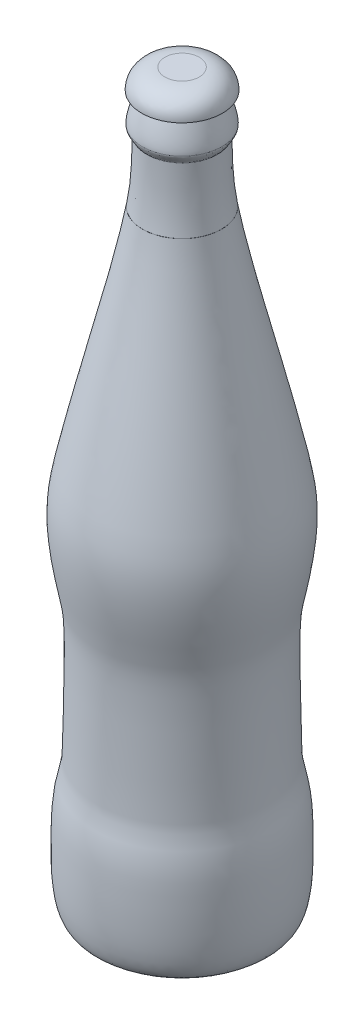
ISO-10303-21;
HEADER;
FILE_DESCRIPTION(('STEP AP214'),'2;1');
FILE_NAME('part.step','',(''),(''),'','','');
FILE_SCHEMA(('AUTOMOTIVE_DESIGN { 1 0 10303 214 1 1 1 1 }'));
ENDSEC;
DATA;
#1=APPLICATION_CONTEXT('core data for automotive mechanical design processes');
#2=APPLICATION_PROTOCOL_DEFINITION('international standard','automotive_design',2000,#1);
#3=PRODUCT_CONTEXT('',#1,'mechanical');
#4=PRODUCT('Part','Part','',(#3));
#5=PRODUCT_RELATED_PRODUCT_CATEGORY('part','',(#4));
#6=PRODUCT_DEFINITION_FORMATION('','',#4);
#7=PRODUCT_DEFINITION_CONTEXT('part definition',#1,'design');
#8=PRODUCT_DEFINITION('design','',#6,#7);
#9=PRODUCT_DEFINITION_SHAPE('','',#8);
#10=(LENGTH_UNIT() NAMED_UNIT(*) SI_UNIT(.MILLI.,.METRE.));
#11=(NAMED_UNIT(*) PLANE_ANGLE_UNIT() SI_UNIT($,.RADIAN.));
#12=(NAMED_UNIT(*) SI_UNIT($,.STERADIAN.) SOLID_ANGLE_UNIT());
#13=UNCERTAINTY_MEASURE_WITH_UNIT(LENGTH_MEASURE(1.E-05),#10,'distance_accuracy_value','');
#14=(GEOMETRIC_REPRESENTATION_CONTEXT(3) GLOBAL_UNCERTAINTY_ASSIGNED_CONTEXT((#13)) GLOBAL_UNIT_ASSIGNED_CONTEXT((#10,
#11,#12)) REPRESENTATION_CONTEXT('',''));
#15=CARTESIAN_POINT('',(0.,0.,0.));
#16=DIRECTION('',(0.,0.,1.));
#17=DIRECTION('',(1.,0.,0.));
#18=AXIS2_PLACEMENT_3D('',#15,#16,#17);
#19=CARTESIAN_POINT('',(92.180574198398,2.22941134140291,0.));
#20=CARTESIAN_POINT('',(90.782969423108,2.22941134140291,0.));
#21=CARTESIAN_POINT('',(90.7514266953795,8.99101118225001,0.));
#22=CARTESIAN_POINT('',(90.9535813247396,13.2770126870321,0.));
#23=CARTESIAN_POINT('',(91.6726217618002,15.743832177917,0.));
#24=CARTESIAN_POINT('',(91.6973159128768,20.0333687138655,0.));
#25=CARTESIAN_POINT('',(92.013516102098,28.6826556376208,0.));
#26=CARTESIAN_POINT('',(91.0574672011757,33.7416290666101,0.));
#27=CARTESIAN_POINT('',(90.0502995797874,38.6479616469551,0.));
#28=CARTESIAN_POINT('',(92.5925774560605,50.7126489157287,0.));
#29=CARTESIAN_POINT('',(95.2450911585632,60.4384755398869,0.));
#30=CARTESIAN_POINT('',(96.7987712013865,68.7213651196662,0.));
#31=CARTESIAN_POINT('',(96.9395140491143,71.1681686496813,0.));
#32=CARTESIAN_POINT('',(96.9395140491143,73.9028779980463,0.));
#33=B_SPLINE_CURVE_WITH_KNOTS('',3,(#19,#20,#21,#22,#23,#24,#25,#26,#27,#28,#29,#30,#31,#32),
.UNSPECIFIED.,.F.,.F.,(4,1,1,1,1,1,1,1,1,1,1,4),(0.,0.0880233428799965,0.127394591547506,
0.153536048006489,0.168258282604305,0.262799309201075,0.291491474000751,0.426487765801391,
0.485596400159271,0.823469183221671,0.879132952994024,1.),.UNSPECIFIED.);
#34=CARTESIAN_POINT('',(100.700070966128,2.22941134140292,0.));
#35=DIRECTION('',(0.,-1.,0.));
#36=AXIS1_PLACEMENT('',#34,#35);
#37=SURFACE_OF_REVOLUTION('',#33,#36);
#38=CARTESIAN_POINT('',(100.700070966128,73.9028779980463,0.));
#39=DIRECTION('',(0.,-1.,0.));
#40=DIRECTION('',(0.,0.,-1.));
#41=AXIS2_PLACEMENT_3D('',#38,#39,#40);
#42=CIRCLE('',#41,3.76055691701373);
#43=CARTESIAN_POINT('',(100.700070966128,73.9028779980463,-3.76055691701373));
#44=VERTEX_POINT('',#43);
#45=EDGE_CURVE('E75',#44,#44,#42,.T.);
#46=ORIENTED_EDGE('',*,*,#45,.T.);
#47=EDGE_LOOP('',(#46));
#48=FACE_BOUND('',#47,.T.);
#49=CARTESIAN_POINT('',(100.700070966128,67.2394113414029,0.));
#50=DIRECTION('',(0.,-1.,0.));
#51=DIRECTION('',(0.,0.,-1.));
#52=AXIS2_PLACEMENT_3D('',#49,#50,#51);
#53=CIRCLE('',#52,4.19864532200152);
#54=CARTESIAN_POINT('',(100.700070966128,67.2394113414029,-4.19864532200152));
#55=VERTEX_POINT('',#54);
#56=EDGE_CURVE('E68',#55,#55,#53,.F.);
#57=ORIENTED_EDGE('',*,*,#56,.T.);
#58=EDGE_LOOP('',(#57));
#59=FACE_BOUND('',#58,.T.);
#60=ADVANCED_FACE('F51',(#48,#59),#37,.F.);
#61=CARTESIAN_POINT('',(96.462790108899,74.8711655812836,0.));
#62=CARTESIAN_POINT('',(96.462790108899,74.5599511646211,0.));
#63=CARTESIAN_POINT('',(96.9395140491143,74.0301221874041,0.));
#64=CARTESIAN_POINT('',(96.9395140491143,73.9028779980463,0.));
#65=B_SPLINE_CURVE_WITH_KNOTS('',3,(#61,#62,#63,#64),.UNSPECIFIED.,.F.,.F.,(4,4),(0.,1.),.UNSPECIFIED.);
#66=CARTESIAN_POINT('',(100.700070966128,2.22941134140292,0.));
#67=DIRECTION('',(0.,-1.,0.));
#68=AXIS1_PLACEMENT('',#66,#67);
#69=SURFACE_OF_REVOLUTION('',#65,#68);
#70=ORIENTED_EDGE('',*,*,#45,.F.);
#71=EDGE_LOOP('',(#70));
#72=FACE_BOUND('',#71,.T.);
#73=CARTESIAN_POINT('',(100.700070966128,74.8711655812836,0.));
#74=DIRECTION('',(0.,-1.,0.));
#75=DIRECTION('',(0.,0.,-1.));
#76=AXIS2_PLACEMENT_3D('',#73,#74,#75);
#77=CIRCLE('',#76,4.23728085722903);
#78=CARTESIAN_POINT('',(100.700070966128,74.8711655812836,-4.23728085722903));
#79=VERTEX_POINT('',#78);
#80=EDGE_CURVE('E72',#79,#79,#77,.T.);
#81=ORIENTED_EDGE('',*,*,#80,.T.);
#82=EDGE_LOOP('',(#81));
#83=FACE_BOUND('',#82,.T.);
#84=ADVANCED_FACE('F89',(#72,#83),#69,.T.);
#85=CARTESIAN_POINT('',(96.462790108899,74.8711655812836,0.));
#86=CARTESIAN_POINT('',(96.462790108899,75.6979332399885,0.));
#87=CARTESIAN_POINT('',(97.3026248003264,77.9722635057142,0.));
#88=B_SPLINE_CURVE_WITH_KNOTS('',2,(#85,#86,#87),.UNSPECIFIED.,.F.,.F.,(3,3),(0.,1.),.UNSPECIFIED.);
#89=CARTESIAN_POINT('',(100.700070966128,2.22941134140292,0.));
#90=DIRECTION('',(0.,-1.,0.));
#91=AXIS1_PLACEMENT('',#89,#90);
#92=SURFACE_OF_REVOLUTION('',#88,#91);
#93=CARTESIAN_POINT('',(100.700070966128,77.9722635057142,0.));
#94=DIRECTION('',(0.,-1.,0.));
#95=DIRECTION('',(0.,0.,-1.));
#96=AXIS2_PLACEMENT_3D('',#93,#94,#95);
#97=CIRCLE('',#96,3.39744616580165);
#98=CARTESIAN_POINT('',(100.700070966128,77.9722635057142,-3.39744616580165));
#99=VERTEX_POINT('',#98);
#100=EDGE_CURVE('E65',#99,#99,#97,.T.);
#101=ORIENTED_EDGE('',*,*,#100,.T.);
#102=EDGE_LOOP('',(#101));
#103=FACE_BOUND('',#102,.T.);
#104=ORIENTED_EDGE('',*,*,#80,.F.);
#105=EDGE_LOOP('',(#104));
#106=FACE_BOUND('',#105,.T.);
#107=ADVANCED_FACE('F92',(#103,#106),#92,.F.);
#108=CARTESIAN_POINT('',(0.,77.9722635057142,0.));
#109=DIRECTION('',(0.,1.,0.));
#110=DIRECTION('',(0.,0.,1.));
#111=AXIS2_PLACEMENT_3D('',#108,#109,#110);
#112=PLANE('',#111);
#113=ORIENTED_EDGE('',*,*,#100,.F.);
#114=EDGE_LOOP('',(#113));
#115=FACE_BOUND('',#114,.T.);
#116=CARTESIAN_POINT('',(100.700070966128,77.9722635057142,0.));
#117=DIRECTION('',(0.,-1.,0.));
#118=DIRECTION('',(0.,0.,-1.));
#119=AXIS2_PLACEMENT_3D('',#116,#117,#118);
#120=CIRCLE('',#119,4.2876652664352);
#121=CARTESIAN_POINT('',(100.700070966128,77.9722635057142,-4.2876652664352));
#122=VERTEX_POINT('',#121);
#123=EDGE_CURVE('E60',#122,#122,#120,.T.);
#124=ORIENTED_EDGE('',*,*,#123,.T.);
#125=EDGE_LOOP('',(#124));
#126=FACE_BOUND('',#125,.T.);
#127=ADVANCED_FACE('F117',(#115,#126),#112,.F.);
#128=CARTESIAN_POINT('',(98.8726107890043,80.0891959381419,0.));
#129=CARTESIAN_POINT('',(97.6184266841694,80.0891959381419,0.));
#130=CARTESIAN_POINT('',(96.4124056996929,79.3528432677335,0.));
#131=CARTESIAN_POINT('',(96.4124056996928,77.9722635057142,0.));
#132=B_SPLINE_CURVE_WITH_KNOTS('',3,(#128,#129,#130,#131),.UNSPECIFIED.,.F.,.F.,(4,4),(0.,1.),.UNSPECIFIED.);
#133=CARTESIAN_POINT('',(100.700070966128,2.22941134140292,0.));
#134=DIRECTION('',(0.,-1.,0.));
#135=AXIS1_PLACEMENT('',#133,#134);
#136=SURFACE_OF_REVOLUTION('',#132,#135);
#137=ORIENTED_EDGE('',*,*,#123,.F.);
#138=EDGE_LOOP('',(#137));
#139=FACE_BOUND('',#138,.T.);
#140=CARTESIAN_POINT('',(100.700070966128,80.0891959381419,0.));
#141=DIRECTION('',(0.,-1.,0.));
#142=DIRECTION('',(0.,0.,-1.));
#143=AXIS2_PLACEMENT_3D('',#140,#141,#142);
#144=CIRCLE('',#143,1.82746017712372);
#145=CARTESIAN_POINT('',(100.700070966128,80.0891959381419,-1.82746017712372));
#146=VERTEX_POINT('',#145);
#147=EDGE_CURVE('E11',#146,#146,#144,.T.);
#148=ORIENTED_EDGE('',*,*,#147,.T.);
#149=EDGE_LOOP('',(#148));
#150=FACE_BOUND('',#149,.T.);
#151=ADVANCED_FACE('F102',(#139,#150),#136,.T.);
#152=CARTESIAN_POINT('',(0.,80.0891959381419,0.));
#153=DIRECTION('',(0.,1.,0.));
#154=DIRECTION('',(0.,0.,1.));
#155=AXIS2_PLACEMENT_3D('',#152,#153,#154);
#156=PLANE('',#155);
#157=ORIENTED_EDGE('',*,*,#147,.F.);
#158=EDGE_LOOP('',(#157));
#159=FACE_BOUND('',#158,.T.);
#160=ADVANCED_FACE('F97',(#159),#156,.T.);
#161=CARTESIAN_POINT('',(100.700070966128,67.2394113414029,0.));
#162=DIRECTION('',(0.,-1.,0.));
#163=DIRECTION('',(0.,0.,-1.));
#164=AXIS2_PLACEMENT_3D('',#161,#162,#163);
#165=PLANE('',#164);
#166=ORIENTED_EDGE('',*,*,#56,.F.);
#167=EDGE_LOOP('',(#166));
#168=FACE_BOUND('',#167,.T.);
#169=ADVANCED_FACE('F95',(#168),#165,.T.);
#170=CLOSED_SHELL('',(#60,#84,#107,#127,#151,#160,#169));
#171=MANIFOLD_SOLID_BREP('B2',#170);
#172=CARTESIAN_POINT('',(100.700070966128,2.62941134140291,0.));
#173=DIRECTION('',(0.,-1.,0.));
#174=DIRECTION('',(0.,0.,-1.));
#175=AXIS2_PLACEMENT_3D('',#172,#173,#174);
#176=PLANE('',#175);
#177=CARTESIAN_POINT('',(100.700070966128,2.62941134140291,0.));
#178=DIRECTION('',(0.,-1.,0.));
#179=DIRECTION('',(0.,0.,-1.));
#180=AXIS2_PLACEMENT_3D('',#177,#178,#179);
#181=CIRCLE('',#180,0.499999999999999);
#182=CARTESIAN_POINT('',(100.700070966128,2.62941134140291,-0.499999999999999));
#183=VERTEX_POINT('',#182);
#184=EDGE_CURVE('E249',#183,#183,#181,.T.);
#185=ORIENTED_EDGE('',*,*,#184,.T.);
#186=EDGE_LOOP('',(#185));
#187=FACE_BOUND('',#186,.T.);
#188=ADVANCED_FACE('F240',(#187),#176,.T.);
#189=CARTESIAN_POINT('',(100.700070966128,2.62941134140291,0.));
#190=DIRECTION('',(0.,-1.,0.));
#191=DIRECTION('',(0.,0.,-1.));
#192=AXIS2_PLACEMENT_3D('',#189,#190,#191);
#193=CYLINDRICAL_SURFACE('',#192,0.499999999999999);
#194=ORIENTED_EDGE('',*,*,#184,.F.);
#195=EDGE_LOOP('',(#194));
#196=FACE_BOUND('',#195,.T.);
#197=CARTESIAN_POINT('',(100.700070966128,2.22941134140291,0.));
#198=DIRECTION('',(0.,-1.,0.));
#199=DIRECTION('',(0.,0.,-1.));
#200=AXIS2_PLACEMENT_3D('',#197,#198,#199);
#201=CIRCLE('',#200,0.499999999999999);
#202=CARTESIAN_POINT('',(100.700070966128,2.22941134140291,-0.499999999999999));
#203=VERTEX_POINT('',#202);
#204=EDGE_CURVE('E253',#203,#203,#201,.T.);
#205=ORIENTED_EDGE('',*,*,#204,.T.);
#206=EDGE_LOOP('',(#205));
#207=FACE_BOUND('',#206,.T.);
#208=ADVANCED_FACE('F278',(#196,#207),#193,.F.);
#209=CARTESIAN_POINT('',(0.,2.22941134140291,0.));
#210=DIRECTION('',(0.,1.,0.));
#211=DIRECTION('',(0.,0.,1.));
#212=AXIS2_PLACEMENT_3D('',#209,#210,#211);
#213=PLANE('',#212);
#214=ORIENTED_EDGE('',*,*,#204,.F.);
#215=EDGE_LOOP('',(#214));
#216=FACE_BOUND('',#215,.T.);
#217=CARTESIAN_POINT('',(100.700070966128,2.22941134140291,0.));
#218=DIRECTION('',(0.,-1.,0.));
#219=DIRECTION('',(0.,0.,-1.));
#220=AXIS2_PLACEMENT_3D('',#217,#218,#219);
#221=CIRCLE('',#220,8.51949676772999);
#222=CARTESIAN_POINT('',(100.700070966128,2.22941134140291,-8.51949676772999));
#223=VERTEX_POINT('',#222);
#224=EDGE_CURVE('E50',#223,#223,#221,.T.);
#225=ORIENTED_EDGE('',*,*,#224,.T.);
#226=EDGE_LOOP('',(#225));
#227=FACE_BOUND('',#226,.T.);
#228=ADVANCED_FACE('F272',(#216,#227),#213,.F.);
#229=CARTESIAN_POINT('',(92.180574198398,2.22941134140291,0.));
#230=CARTESIAN_POINT('',(90.782969423108,2.22941134140291,0.));
#231=CARTESIAN_POINT('',(90.7514266953795,8.99101118225001,0.));
#232=CARTESIAN_POINT('',(90.9535813247396,13.2770126870321,0.));
#233=CARTESIAN_POINT('',(91.6726217618002,15.743832177917,0.));
#234=CARTESIAN_POINT('',(91.6973159128768,20.0333687138655,0.));
#235=CARTESIAN_POINT('',(92.013516102098,28.6826556376208,0.));
#236=CARTESIAN_POINT('',(91.0574672011757,33.7416290666101,0.));
#237=CARTESIAN_POINT('',(90.0502995797874,38.6479616469551,0.));
#238=CARTESIAN_POINT('',(92.5925774560605,50.7126489157287,0.));
#239=CARTESIAN_POINT('',(95.2450911585632,60.4384755398869,0.));
#240=CARTESIAN_POINT('',(96.7987712013865,68.7213651196662,0.));
#241=CARTESIAN_POINT('',(96.9395140491143,71.1681686496813,0.));
#242=CARTESIAN_POINT('',(96.9395140491143,73.9028779980463,0.));
#243=B_SPLINE_CURVE_WITH_KNOTS('',3,(#229,#230,#231,#232,#233,#234,#235,#236,#237,#238,#239,
#240,#241,#242),.UNSPECIFIED.,.F.,.F.,(4,1,1,1,1,1,1,1,1,1,1,4),(0.,0.0880233428799965,
0.127394591547506,0.153536048006489,0.168258282604305,0.262799309201075,0.291491474000751,
0.426487765801391,0.485596400159271,0.823469183221671,0.879132952994024,1.),.UNSPECIFIED.);
#244=CARTESIAN_POINT('',(100.700070966128,2.22941134140292,0.));
#245=DIRECTION('',(0.,-1.,0.));
#246=AXIS1_PLACEMENT('',#244,#245);
#247=SURFACE_OF_REVOLUTION('',#243,#246);
#248=CARTESIAN_POINT('',(100.700070966128,67.2294113414029,0.));
#249=DIRECTION('',(0.,-1.,0.));
#250=DIRECTION('',(0.,0.,-1.));
#251=AXIS2_PLACEMENT_3D('',#248,#249,#250);
#252=CIRCLE('',#251,4.2002642104037);
#253=CARTESIAN_POINT('',(100.700070966128,67.2294113414029,-4.2002642104037));
#254=VERTEX_POINT('',#253);
#255=EDGE_CURVE('E245',#254,#254,#252,.F.);
#256=ORIENTED_EDGE('',*,*,#255,.F.);
#257=EDGE_LOOP('',(#256));
#258=FACE_BOUND('',#257,.T.);
#259=ORIENTED_EDGE('',*,*,#224,.F.);
#260=EDGE_LOOP('',(#259));
#261=FACE_BOUND('',#260,.T.);
#262=ADVANCED_FACE('F242',(#258,#261),#247,.F.);
#263=CARTESIAN_POINT('',(100.700070966128,67.2294113414029,0.));
#264=DIRECTION('',(0.,-1.,0.));
#265=DIRECTION('',(0.,0.,-1.));
#266=AXIS2_PLACEMENT_3D('',#263,#264,#265);
#267=PLANE('',#266);
#268=ORIENTED_EDGE('',*,*,#255,.T.);
#269=EDGE_LOOP('',(#268));
#270=FACE_BOUND('',#269,.T.);
#271=ADVANCED_FACE('F268',(#270),#267,.F.);
#272=CLOSED_SHELL('',(#188,#208,#228,#262,#271));
#273=MANIFOLD_SOLID_BREP('B6',#272);
#274=ADVANCED_BREP_SHAPE_REPRESENTATION('',(#18,#171,#273),#14);
#275=SHAPE_DEFINITION_REPRESENTATION(#9,#274);
ENDSEC;
END-ISO-10303-21;
